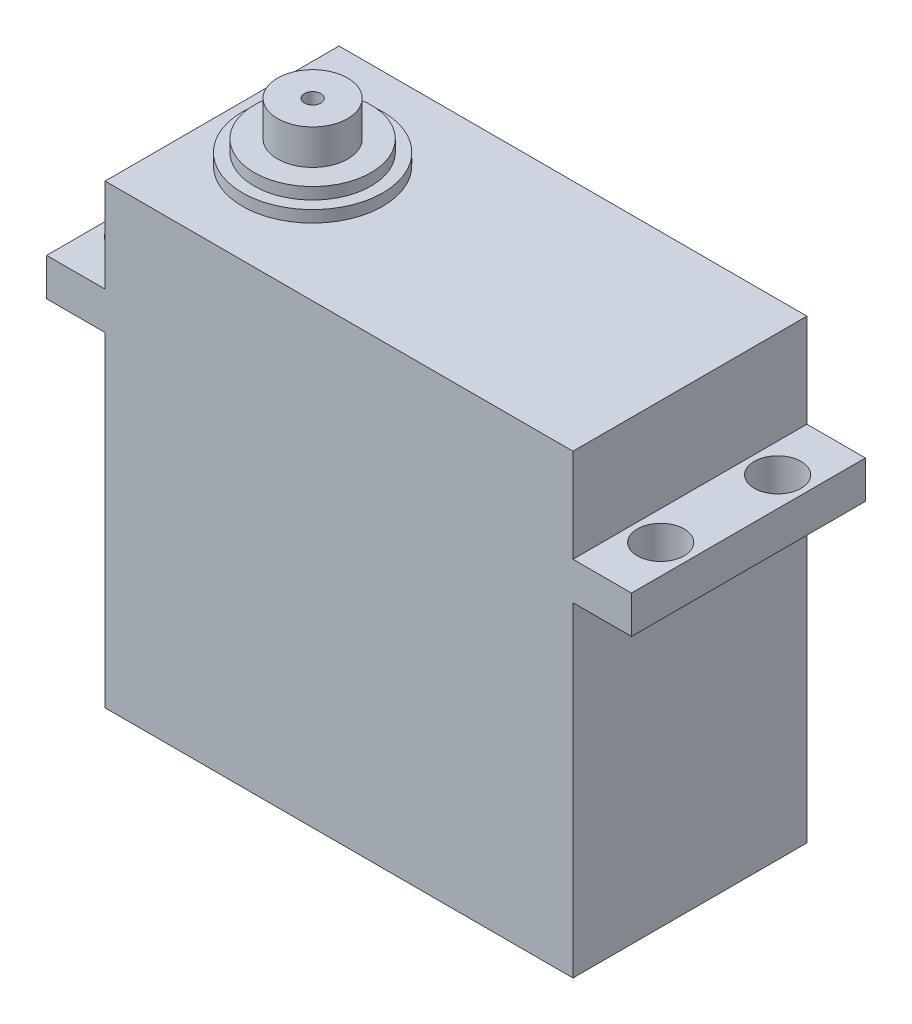
ISO-10303-21;
HEADER;
FILE_DESCRIPTION(('STEP AP214'),'2;1');
FILE_NAME('part.step','',(''),(''),'','','');
FILE_SCHEMA(('AUTOMOTIVE_DESIGN { 1 0 10303 214 1 1 1 1 }'));
ENDSEC;
DATA;
#1=APPLICATION_CONTEXT('core data for automotive mechanical design processes');
#2=APPLICATION_PROTOCOL_DEFINITION('international standard','automotive_design',2000,#1);
#3=PRODUCT_CONTEXT('',#1,'mechanical');
#4=PRODUCT('Part','Part','',(#3));
#5=PRODUCT_RELATED_PRODUCT_CATEGORY('part','',(#4));
#6=PRODUCT_DEFINITION_FORMATION('','',#4);
#7=PRODUCT_DEFINITION_CONTEXT('part definition',#1,'design');
#8=PRODUCT_DEFINITION('design','',#6,#7);
#9=PRODUCT_DEFINITION_SHAPE('','',#8);
#10=(LENGTH_UNIT() NAMED_UNIT(*) SI_UNIT(.MILLI.,.METRE.));
#11=(NAMED_UNIT(*) PLANE_ANGLE_UNIT() SI_UNIT($,.RADIAN.));
#12=(NAMED_UNIT(*) SI_UNIT($,.STERADIAN.) SOLID_ANGLE_UNIT());
#13=UNCERTAINTY_MEASURE_WITH_UNIT(LENGTH_MEASURE(1.E-05),#10,'distance_accuracy_value','');
#14=(GEOMETRIC_REPRESENTATION_CONTEXT(3) GLOBAL_UNCERTAINTY_ASSIGNED_CONTEXT((#13)) GLOBAL_UNIT_ASSIGNED_CONTEXT((#10,
#11,#12)) REPRESENTATION_CONTEXT('',''));
#15=CARTESIAN_POINT('',(0.,0.,0.));
#16=DIRECTION('',(0.,0.,1.));
#17=DIRECTION('',(1.,0.,0.));
#18=AXIS2_PLACEMENT_3D('',#15,#16,#17);
#19=CARTESIAN_POINT('',(7.01195219123506,37.7942609289085,20.));
#20=DIRECTION('',(-1.,0.,0.));
#21=DIRECTION('',(0.,0.,1.));
#22=AXIS2_PLACEMENT_3D('',#19,#20,#21);
#23=PLANE('',#22);
#24=DIRECTION('',(0.,0.,1.));
#25=VECTOR('',#24,1.);
#26=CARTESIAN_POINT('',(7.01195219123506,29.7942609289085,20.));
#27=LINE('',#26,#25);
#28=CARTESIAN_POINT('',(7.01195219123506,29.7942609289085,0.));
#29=VERTEX_POINT('',#28);
#30=CARTESIAN_POINT('',(7.01195219123506,29.7942609289085,20.));
#31=VERTEX_POINT('',#30);
#32=EDGE_CURVE('E155',#29,#31,#27,.T.);
#33=ORIENTED_EDGE('',*,*,#32,.F.);
#34=DIRECTION('',(0.,1.,0.));
#35=VECTOR('',#34,1.);
#36=CARTESIAN_POINT('',(7.01195219123506,37.7942609289085,0.));
#37=LINE('',#36,#35);
#38=CARTESIAN_POINT('',(7.01195219123506,37.7942609289085,0.));
#39=VERTEX_POINT('',#38);
#40=EDGE_CURVE('E203',#29,#39,#37,.T.);
#41=ORIENTED_EDGE('',*,*,#40,.T.);
#42=DIRECTION('',(0.,0.,-1.));
#43=VECTOR('',#42,1.);
#44=CARTESIAN_POINT('',(7.01195219123506,37.7942609289085,20.));
#45=LINE('',#44,#43);
#46=CARTESIAN_POINT('',(7.01195219123506,37.7942609289085,20.));
#47=VERTEX_POINT('',#46);
#48=EDGE_CURVE('E51',#47,#39,#45,.T.);
#49=ORIENTED_EDGE('',*,*,#48,.F.);
#50=DIRECTION('',(0.,1.,0.));
#51=VECTOR('',#50,1.);
#52=CARTESIAN_POINT('',(7.01195219123506,37.7942609289085,20.));
#53=LINE('',#52,#51);
#54=EDGE_CURVE('E59',#31,#47,#53,.T.);
#55=ORIENTED_EDGE('',*,*,#54,.F.);
#56=EDGE_LOOP('',(#33,#41,#49,#55));
#57=FACE_BOUND('',#56,.T.);
#58=ADVANCED_FACE('F42',(#57),#23,.F.);
#59=DIRECTION('',(0.,0.,-1.));
#60=VECTOR('',#59,1.);
#61=CARTESIAN_POINT('',(7.01195219123506,26.5790810906452,20.));
#62=LINE('',#61,#60);
#63=CARTESIAN_POINT('',(7.01195219123506,26.5790810906452,20.));
#64=VERTEX_POINT('',#63);
#65=CARTESIAN_POINT('',(7.01195219123506,26.5790810906452,0.));
#66=VERTEX_POINT('',#65);
#67=EDGE_CURVE('E67',#64,#66,#62,.T.);
#68=ORIENTED_EDGE('',*,*,#67,.F.);
#69=CARTESIAN_POINT('',(7.01195219123506,-1.20573907109151,20.));
#70=VERTEX_POINT('',#69);
#71=EDGE_CURVE('E158',#70,#64,#53,.T.);
#72=ORIENTED_EDGE('',*,*,#71,.F.);
#73=DIRECTION('',(0.,0.,-1.));
#74=VECTOR('',#73,1.);
#75=CARTESIAN_POINT('',(7.01195219123506,-1.20573907109151,20.));
#76=LINE('',#75,#74);
#77=CARTESIAN_POINT('',(7.01195219123506,-1.20573907109151,0.));
#78=VERTEX_POINT('',#77);
#79=EDGE_CURVE('E217',#70,#78,#76,.T.);
#80=ORIENTED_EDGE('',*,*,#79,.T.);
#81=EDGE_CURVE('E218',#78,#66,#37,.T.);
#82=ORIENTED_EDGE('',*,*,#81,.T.);
#83=EDGE_LOOP('',(#68,#72,#80,#82));
#84=FACE_BOUND('',#83,.T.);
#85=ADVANCED_FACE('F333',(#84),#23,.F.);
#86=CARTESIAN_POINT('',(-32.9880478087649,37.7942609289085,20.));
#87=DIRECTION('',(1.,0.,0.));
#88=DIRECTION('',(0.,0.,-1.));
#89=AXIS2_PLACEMENT_3D('',#86,#87,#88);
#90=PLANE('',#89);
#91=DIRECTION('',(0.,0.,-1.));
#92=VECTOR('',#91,1.);
#93=CARTESIAN_POINT('',(-32.9880478087649,29.7942609289085,0.));
#94=LINE('',#93,#92);
#95=CARTESIAN_POINT('',(-32.9880478087649,29.7942609289085,20.));
#96=VERTEX_POINT('',#95);
#97=CARTESIAN_POINT('',(-32.9880478087649,29.7942609289085,0.));
#98=VERTEX_POINT('',#97);
#99=EDGE_CURVE('E165',#96,#98,#94,.T.);
#100=ORIENTED_EDGE('',*,*,#99,.F.);
#101=DIRECTION('',(0.,-1.,0.));
#102=VECTOR('',#101,1.);
#103=CARTESIAN_POINT('',(-32.9880478087649,37.7942609289085,20.));
#104=LINE('',#103,#102);
#105=CARTESIAN_POINT('',(-32.9880478087649,37.7942609289085,20.));
#106=VERTEX_POINT('',#105);
#107=EDGE_CURVE('E210',#106,#96,#104,.T.);
#108=ORIENTED_EDGE('',*,*,#107,.F.);
#109=DIRECTION('',(0.,0.,-1.));
#110=VECTOR('',#109,1.);
#111=CARTESIAN_POINT('',(-32.9880478087649,37.7942609289085,20.));
#112=LINE('',#111,#110);
#113=CARTESIAN_POINT('',(-32.9880478087649,37.7942609289085,0.));
#114=VERTEX_POINT('',#113);
#115=EDGE_CURVE('E238',#106,#114,#112,.T.);
#116=ORIENTED_EDGE('',*,*,#115,.T.);
#117=DIRECTION('',(0.,-1.,0.));
#118=VECTOR('',#117,1.);
#119=CARTESIAN_POINT('',(-32.9880478087649,37.7942609289085,0.));
#120=LINE('',#119,#118);
#121=EDGE_CURVE('E225',#114,#98,#120,.T.);
#122=ORIENTED_EDGE('',*,*,#121,.T.);
#123=EDGE_LOOP('',(#100,#108,#116,#122));
#124=FACE_BOUND('',#123,.T.);
#125=ADVANCED_FACE('F335',(#124),#90,.F.);
#126=DIRECTION('',(0.,0.,1.));
#127=VECTOR('',#126,1.);
#128=CARTESIAN_POINT('',(-32.9880478087649,26.5790810906452,0.));
#129=LINE('',#128,#127);
#130=CARTESIAN_POINT('',(-32.9880478087649,26.5790810906452,0.));
#131=VERTEX_POINT('',#130);
#132=CARTESIAN_POINT('',(-32.9880478087649,26.5790810906452,20.));
#133=VERTEX_POINT('',#132);
#134=EDGE_CURVE('E160',#131,#133,#129,.T.);
#135=ORIENTED_EDGE('',*,*,#134,.F.);
#136=CARTESIAN_POINT('',(-32.9880478087649,-1.20573907109151,0.));
#137=VERTEX_POINT('',#136);
#138=EDGE_CURVE('E224',#131,#137,#120,.T.);
#139=ORIENTED_EDGE('',*,*,#138,.T.);
#140=DIRECTION('',(0.,0.,-1.));
#141=VECTOR('',#140,1.);
#142=CARTESIAN_POINT('',(-32.9880478087649,-1.20573907109151,20.));
#143=LINE('',#142,#141);
#144=CARTESIAN_POINT('',(-32.9880478087649,-1.20573907109151,20.));
#145=VERTEX_POINT('',#144);
#146=EDGE_CURVE('E234',#145,#137,#143,.T.);
#147=ORIENTED_EDGE('',*,*,#146,.F.);
#148=EDGE_CURVE('E209',#133,#145,#104,.T.);
#149=ORIENTED_EDGE('',*,*,#148,.F.);
#150=EDGE_LOOP('',(#135,#139,#147,#149));
#151=FACE_BOUND('',#150,.T.);
#152=ADVANCED_FACE('F328',(#151),#90,.F.);
#153=CARTESIAN_POINT('',(-32.9880478087649,37.7942609289085,20.));
#154=DIRECTION('',(0.,-1.,0.));
#155=DIRECTION('',(0.,0.,-1.));
#156=AXIS2_PLACEMENT_3D('',#153,#154,#155);
#157=PLANE('',#156);
#158=CARTESIAN_POINT('',(-25.2449941629393,37.7942609289085,10.));
#159=DIRECTION('',(0.,-1.,0.));
#160=DIRECTION('',(0.,0.,-1.));
#161=AXIS2_PLACEMENT_3D('',#158,#159,#160);
#162=CIRCLE('',#161,6.);
#163=CARTESIAN_POINT('',(-25.2449941629393,37.7942609289085,4.));
#164=VERTEX_POINT('',#163);
#165=EDGE_CURVE('E11',#164,#164,#162,.F.);
#166=ORIENTED_EDGE('',*,*,#165,.F.);
#167=EDGE_LOOP('',(#166));
#168=FACE_BOUND('',#167,.T.);
#169=DIRECTION('',(-1.,0.,0.));
#170=VECTOR('',#169,1.);
#171=CARTESIAN_POINT('',(-32.9880478087649,37.7942609289085,0.));
#172=LINE('',#171,#170);
#173=EDGE_CURVE('E221',#39,#114,#172,.T.);
#174=ORIENTED_EDGE('',*,*,#173,.T.);
#175=ORIENTED_EDGE('',*,*,#115,.F.);
#176=DIRECTION('',(-1.,0.,0.));
#177=VECTOR('',#176,1.);
#178=CARTESIAN_POINT('',(-32.9880478087649,37.7942609289085,20.));
#179=LINE('',#178,#177);
#180=EDGE_CURVE('E206',#47,#106,#179,.T.);
#181=ORIENTED_EDGE('',*,*,#180,.F.);
#182=ORIENTED_EDGE('',*,*,#48,.T.);
#183=EDGE_LOOP('',(#174,#175,#181,#182));
#184=FACE_BOUND('',#183,.T.);
#185=ADVANCED_FACE('F477',(#168,#184),#157,.F.);
#186=CARTESIAN_POINT('',(-32.9880478087649,-1.20573907109151,20.));
#187=DIRECTION('',(0.,1.,0.));
#188=DIRECTION('',(0.,0.,1.));
#189=AXIS2_PLACEMENT_3D('',#186,#187,#188);
#190=PLANE('',#189);
#191=DIRECTION('',(1.,0.,0.));
#192=VECTOR('',#191,1.);
#193=CARTESIAN_POINT('',(-32.9880478087649,-1.20573907109151,0.));
#194=LINE('',#193,#192);
#195=EDGE_CURVE('E228',#137,#78,#194,.T.);
#196=ORIENTED_EDGE('',*,*,#195,.T.);
#197=ORIENTED_EDGE('',*,*,#79,.F.);
#198=DIRECTION('',(1.,0.,0.));
#199=VECTOR('',#198,1.);
#200=CARTESIAN_POINT('',(-32.9880478087649,-1.20573907109151,20.));
#201=LINE('',#200,#199);
#202=EDGE_CURVE('E214',#145,#70,#201,.T.);
#203=ORIENTED_EDGE('',*,*,#202,.F.);
#204=ORIENTED_EDGE('',*,*,#146,.T.);
#205=EDGE_LOOP('',(#196,#197,#203,#204));
#206=FACE_BOUND('',#205,.T.);
#207=ADVANCED_FACE('F332',(#206),#190,.F.);
#208=CARTESIAN_POINT('',(0.,0.,20.));
#209=DIRECTION('',(0.,0.,1.));
#210=DIRECTION('',(1.,0.,0.));
#211=AXIS2_PLACEMENT_3D('',#208,#209,#210);
#212=PLANE('',#211);
#213=ORIENTED_EDGE('',*,*,#71,.T.);
#214=DIRECTION('',(-1.,0.,0.));
#215=VECTOR('',#214,1.);
#216=CARTESIAN_POINT('',(12.0119521912351,26.5790810906452,20.));
#217=LINE('',#216,#215);
#218=CARTESIAN_POINT('',(12.0119521912351,26.5790810906452,20.));
#219=VERTEX_POINT('',#218);
#220=EDGE_CURVE('E138',#219,#64,#217,.T.);
#221=ORIENTED_EDGE('',*,*,#220,.F.);
#222=DIRECTION('',(0.,-1.,0.));
#223=VECTOR('',#222,1.);
#224=CARTESIAN_POINT('',(12.0119521912351,29.7942609289085,20.));
#225=LINE('',#224,#223);
#226=CARTESIAN_POINT('',(12.0119521912351,29.7942609289085,20.));
#227=VERTEX_POINT('',#226);
#228=EDGE_CURVE('E145',#227,#219,#225,.T.);
#229=ORIENTED_EDGE('',*,*,#228,.F.);
#230=DIRECTION('',(-1.,0.,0.));
#231=VECTOR('',#230,1.);
#232=CARTESIAN_POINT('',(12.0119521912351,29.7942609289085,20.));
#233=LINE('',#232,#231);
#234=EDGE_CURVE('E301',#227,#31,#233,.T.);
#235=ORIENTED_EDGE('',*,*,#234,.T.);
#236=ORIENTED_EDGE('',*,*,#54,.T.);
#237=ORIENTED_EDGE('',*,*,#180,.T.);
#238=ORIENTED_EDGE('',*,*,#107,.T.);
#239=DIRECTION('',(1.,0.,0.));
#240=VECTOR('',#239,1.);
#241=CARTESIAN_POINT('',(-37.9880478087649,29.7942609289085,20.));
#242=LINE('',#241,#240);
#243=CARTESIAN_POINT('',(-37.9880478087649,29.7942609289085,20.));
#244=VERTEX_POINT('',#243);
#245=EDGE_CURVE('E191',#244,#96,#242,.T.);
#246=ORIENTED_EDGE('',*,*,#245,.F.);
#247=DIRECTION('',(0.,1.,0.));
#248=VECTOR('',#247,1.);
#249=CARTESIAN_POINT('',(-37.9880478087649,29.7942609289085,20.));
#250=LINE('',#249,#248);
#251=CARTESIAN_POINT('',(-37.9880478087649,26.5790810906452,20.));
#252=VERTEX_POINT('',#251);
#253=EDGE_CURVE('E178',#252,#244,#250,.T.);
#254=ORIENTED_EDGE('',*,*,#253,.F.);
#255=DIRECTION('',(1.,0.,0.));
#256=VECTOR('',#255,1.);
#257=CARTESIAN_POINT('',(-37.9880478087649,26.5790810906452,20.));
#258=LINE('',#257,#256);
#259=EDGE_CURVE('E195',#252,#133,#258,.T.);
#260=ORIENTED_EDGE('',*,*,#259,.T.);
#261=ORIENTED_EDGE('',*,*,#148,.T.);
#262=ORIENTED_EDGE('',*,*,#202,.T.);
#263=EDGE_LOOP('',(#213,#221,#229,#235,#236,#237,#238,#246,#254,#260,#261,#262));
#264=FACE_BOUND('',#263,.T.);
#265=ADVANCED_FACE('F157',(#264),#212,.T.);
#266=CARTESIAN_POINT('',(0.,0.,0.));
#267=DIRECTION('',(0.,0.,1.));
#268=DIRECTION('',(1.,0.,0.));
#269=AXIS2_PLACEMENT_3D('',#266,#267,#268);
#270=PLANE('',#269);
#271=ORIENTED_EDGE('',*,*,#81,.F.);
#272=ORIENTED_EDGE('',*,*,#195,.F.);
#273=ORIENTED_EDGE('',*,*,#138,.F.);
#274=DIRECTION('',(1.,0.,0.));
#275=VECTOR('',#274,1.);
#276=CARTESIAN_POINT('',(-37.9880478087649,26.5790810906452,0.));
#277=LINE('',#276,#275);
#278=CARTESIAN_POINT('',(-37.9880478087649,26.5790810906452,0.));
#279=VERTEX_POINT('',#278);
#280=EDGE_CURVE('E199',#279,#131,#277,.T.);
#281=ORIENTED_EDGE('',*,*,#280,.F.);
#282=DIRECTION('',(0.,-1.,0.));
#283=VECTOR('',#282,1.);
#284=CARTESIAN_POINT('',(-37.9880478087649,29.7942609289085,0.));
#285=LINE('',#284,#283);
#286=CARTESIAN_POINT('',(-37.9880478087649,29.7942609289085,0.));
#287=VERTEX_POINT('',#286);
#288=EDGE_CURVE('E171',#287,#279,#285,.T.);
#289=ORIENTED_EDGE('',*,*,#288,.F.);
#290=DIRECTION('',(1.,0.,0.));
#291=VECTOR('',#290,1.);
#292=CARTESIAN_POINT('',(-37.9880478087649,29.7942609289085,0.));
#293=LINE('',#292,#291);
#294=EDGE_CURVE('E183',#287,#98,#293,.T.);
#295=ORIENTED_EDGE('',*,*,#294,.T.);
#296=ORIENTED_EDGE('',*,*,#121,.F.);
#297=ORIENTED_EDGE('',*,*,#173,.F.);
#298=ORIENTED_EDGE('',*,*,#40,.F.);
#299=DIRECTION('',(-1.,0.,0.));
#300=VECTOR('',#299,1.);
#301=CARTESIAN_POINT('',(12.0119521912351,29.7942609289085,0.));
#302=LINE('',#301,#300);
#303=CARTESIAN_POINT('',(12.0119521912351,29.7942609289085,0.));
#304=VERTEX_POINT('',#303);
#305=EDGE_CURVE('E167',#304,#29,#302,.T.);
#306=ORIENTED_EDGE('',*,*,#305,.F.);
#307=DIRECTION('',(0.,1.,0.));
#308=VECTOR('',#307,1.);
#309=CARTESIAN_POINT('',(12.0119521912351,29.7942609289085,0.));
#310=LINE('',#309,#308);
#311=CARTESIAN_POINT('',(12.0119521912351,26.5790810906452,0.));
#312=VERTEX_POINT('',#311);
#313=EDGE_CURVE('E144',#312,#304,#310,.T.);
#314=ORIENTED_EDGE('',*,*,#313,.F.);
#315=DIRECTION('',(-1.,0.,0.));
#316=VECTOR('',#315,1.);
#317=CARTESIAN_POINT('',(12.0119521912351,26.5790810906452,0.));
#318=LINE('',#317,#316);
#319=EDGE_CURVE('E140',#312,#66,#318,.T.);
#320=ORIENTED_EDGE('',*,*,#319,.T.);
#321=EDGE_LOOP('',(#271,#272,#273,#281,#289,#295,#296,#297,#298,#306,#314,#320));
#322=FACE_BOUND('',#321,.T.);
#323=ADVANCED_FACE('F315',(#322),#270,.F.);
#324=CARTESIAN_POINT('',(-37.9880478087649,26.5790810906452,0.));
#325=DIRECTION('',(0.,1.,0.));
#326=DIRECTION('',(0.,0.,1.));
#327=AXIS2_PLACEMENT_3D('',#324,#325,#326);
#328=PLANE('',#327);
#329=CARTESIAN_POINT('',(-35.4880478087649,26.5790810889085,5.33897843853245));
#330=DIRECTION('',(0.,1.,0.));
#331=DIRECTION('',(0.,0.,1.));
#332=AXIS2_PLACEMENT_3D('',#329,#330,#331);
#333=CIRCLE('',#332,2.);
#334=CARTESIAN_POINT('',(-35.4880478087649,26.5790810889085,7.33897843853245));
#335=VERTEX_POINT('',#334);
#336=EDGE_CURVE('E282',#335,#335,#333,.T.);
#337=ORIENTED_EDGE('',*,*,#336,.T.);
#338=EDGE_LOOP('',(#337));
#339=FACE_BOUND('',#338,.T.);
#340=CARTESIAN_POINT('',(-35.4880478087649,26.5790810889085,14.7315051308545));
#341=DIRECTION('',(0.,1.,0.));
#342=DIRECTION('',(0.,0.,1.));
#343=AXIS2_PLACEMENT_3D('',#340,#341,#342);
#344=CIRCLE('',#343,2.);
#345=CARTESIAN_POINT('',(-35.4880478087649,26.5790810889085,16.7315051308545));
#346=VERTEX_POINT('',#345);
#347=EDGE_CURVE('E290',#346,#346,#344,.T.);
#348=ORIENTED_EDGE('',*,*,#347,.T.);
#349=EDGE_LOOP('',(#348));
#350=FACE_BOUND('',#349,.T.);
#351=ORIENTED_EDGE('',*,*,#134,.T.);
#352=ORIENTED_EDGE('',*,*,#259,.F.);
#353=DIRECTION('',(0.,0.,1.));
#354=VECTOR('',#353,1.);
#355=CARTESIAN_POINT('',(-37.9880478087649,26.5790810906452,0.));
#356=LINE('',#355,#354);
#357=EDGE_CURVE('E175',#279,#252,#356,.T.);
#358=ORIENTED_EDGE('',*,*,#357,.F.);
#359=ORIENTED_EDGE('',*,*,#280,.T.);
#360=EDGE_LOOP('',(#351,#352,#358,#359));
#361=FACE_BOUND('',#360,.T.);
#362=ADVANCED_FACE('F375',(#339,#350,#361),#328,.F.);
#363=CARTESIAN_POINT('',(-37.9880478087649,29.7942609289085,0.));
#364=DIRECTION('',(0.,-1.,0.));
#365=DIRECTION('',(0.,0.,-1.));
#366=AXIS2_PLACEMENT_3D('',#363,#364,#365);
#367=PLANE('',#366);
#368=CARTESIAN_POINT('',(-35.4880478087649,29.7942609289085,5.33897843853245));
#369=DIRECTION('',(0.,1.,0.));
#370=DIRECTION('',(0.,0.,1.));
#371=AXIS2_PLACEMENT_3D('',#368,#369,#370);
#372=CIRCLE('',#371,2.);
#373=CARTESIAN_POINT('',(-35.4880478087649,29.7942609289085,7.33897843853245));
#374=VERTEX_POINT('',#373);
#375=EDGE_CURVE('E286',#374,#374,#372,.T.);
#376=ORIENTED_EDGE('',*,*,#375,.F.);
#377=EDGE_LOOP('',(#376));
#378=FACE_BOUND('',#377,.T.);
#379=CARTESIAN_POINT('',(-35.4880478087649,29.7942609289085,14.7315051308545));
#380=DIRECTION('',(0.,1.,0.));
#381=DIRECTION('',(0.,0.,1.));
#382=AXIS2_PLACEMENT_3D('',#379,#380,#381);
#383=CIRCLE('',#382,2.);
#384=CARTESIAN_POINT('',(-35.4880478087649,29.7942609289085,16.7315051308545));
#385=VERTEX_POINT('',#384);
#386=EDGE_CURVE('E270',#385,#385,#383,.T.);
#387=ORIENTED_EDGE('',*,*,#386,.F.);
#388=EDGE_LOOP('',(#387));
#389=FACE_BOUND('',#388,.T.);
#390=ORIENTED_EDGE('',*,*,#99,.T.);
#391=ORIENTED_EDGE('',*,*,#294,.F.);
#392=DIRECTION('',(0.,0.,-1.));
#393=VECTOR('',#392,1.);
#394=CARTESIAN_POINT('',(-37.9880478087649,29.7942609289085,0.));
#395=LINE('',#394,#393);
#396=EDGE_CURVE('E181',#244,#287,#395,.T.);
#397=ORIENTED_EDGE('',*,*,#396,.F.);
#398=ORIENTED_EDGE('',*,*,#245,.T.);
#399=EDGE_LOOP('',(#390,#391,#397,#398));
#400=FACE_BOUND('',#399,.T.);
#401=ADVANCED_FACE('F400',(#378,#389,#400),#367,.F.);
#402=CARTESIAN_POINT('',(-37.9880478087649,0.,0.));
#403=DIRECTION('',(-1.,0.,0.));
#404=DIRECTION('',(0.,0.,1.));
#405=AXIS2_PLACEMENT_3D('',#402,#403,#404);
#406=PLANE('',#405);
#407=ORIENTED_EDGE('',*,*,#288,.T.);
#408=ORIENTED_EDGE('',*,*,#357,.T.);
#409=ORIENTED_EDGE('',*,*,#253,.T.);
#410=ORIENTED_EDGE('',*,*,#396,.T.);
#411=EDGE_LOOP('',(#407,#408,#409,#410));
#412=FACE_BOUND('',#411,.T.);
#413=ADVANCED_FACE('F351',(#412),#406,.T.);
#414=CARTESIAN_POINT('',(12.0119521912351,26.5790810906452,20.));
#415=DIRECTION('',(0.,1.,0.));
#416=DIRECTION('',(0.,0.,1.));
#417=AXIS2_PLACEMENT_3D('',#414,#415,#416);
#418=PLANE('',#417);
#419=CARTESIAN_POINT('',(9.51195219123506,26.5790810889085,15.));
#420=DIRECTION('',(0.,1.,0.));
#421=DIRECTION('',(0.,0.,1.));
#422=AXIS2_PLACEMENT_3D('',#419,#420,#421);
#423=CIRCLE('',#422,2.);
#424=CARTESIAN_POINT('',(9.51195219123506,26.5790810889085,17.));
#425=VERTEX_POINT('',#424);
#426=EDGE_CURVE('E266',#425,#425,#423,.T.);
#427=ORIENTED_EDGE('',*,*,#426,.T.);
#428=EDGE_LOOP('',(#427));
#429=FACE_BOUND('',#428,.T.);
#430=CARTESIAN_POINT('',(9.51195219123506,26.5790810889085,5.));
#431=DIRECTION('',(0.,1.,0.));
#432=DIRECTION('',(0.,0.,1.));
#433=AXIS2_PLACEMENT_3D('',#430,#431,#432);
#434=CIRCLE('',#433,2.);
#435=CARTESIAN_POINT('',(9.51195219123506,26.5790810889085,7.));
#436=VERTEX_POINT('',#435);
#437=EDGE_CURVE('E254',#436,#436,#434,.T.);
#438=ORIENTED_EDGE('',*,*,#437,.T.);
#439=EDGE_LOOP('',(#438));
#440=FACE_BOUND('',#439,.T.);
#441=ORIENTED_EDGE('',*,*,#67,.T.);
#442=ORIENTED_EDGE('',*,*,#319,.F.);
#443=DIRECTION('',(0.,0.,-1.));
#444=VECTOR('',#443,1.);
#445=CARTESIAN_POINT('',(12.0119521912351,26.5790810906452,20.));
#446=LINE('',#445,#444);
#447=EDGE_CURVE('E134',#219,#312,#446,.T.);
#448=ORIENTED_EDGE('',*,*,#447,.F.);
#449=ORIENTED_EDGE('',*,*,#220,.T.);
#450=EDGE_LOOP('',(#441,#442,#448,#449));
#451=FACE_BOUND('',#450,.T.);
#452=ADVANCED_FACE('F136',(#429,#440,#451),#418,.F.);
#453=CARTESIAN_POINT('',(12.0119521912351,29.7942609289085,20.));
#454=DIRECTION('',(0.,-1.,0.));
#455=DIRECTION('',(0.,0.,-1.));
#456=AXIS2_PLACEMENT_3D('',#453,#454,#455);
#457=PLANE('',#456);
#458=CARTESIAN_POINT('',(9.51195219123506,29.7942609289085,15.));
#459=DIRECTION('',(0.,1.,0.));
#460=DIRECTION('',(0.,0.,1.));
#461=AXIS2_PLACEMENT_3D('',#458,#459,#460);
#462=CIRCLE('',#461,2.);
#463=CARTESIAN_POINT('',(9.51195219123506,29.7942609289085,17.));
#464=VERTEX_POINT('',#463);
#465=EDGE_CURVE('E271',#464,#464,#462,.T.);
#466=ORIENTED_EDGE('',*,*,#465,.F.);
#467=EDGE_LOOP('',(#466));
#468=FACE_BOUND('',#467,.T.);
#469=CARTESIAN_POINT('',(9.51195219123506,29.7942609289085,5.));
#470=DIRECTION('',(0.,1.,0.));
#471=DIRECTION('',(0.,0.,1.));
#472=AXIS2_PLACEMENT_3D('',#469,#470,#471);
#473=CIRCLE('',#472,2.);
#474=CARTESIAN_POINT('',(9.51195219123506,29.7942609289085,7.));
#475=VERTEX_POINT('',#474);
#476=EDGE_CURVE('E275',#475,#475,#473,.T.);
#477=ORIENTED_EDGE('',*,*,#476,.F.);
#478=EDGE_LOOP('',(#477));
#479=FACE_BOUND('',#478,.T.);
#480=ORIENTED_EDGE('',*,*,#32,.T.);
#481=ORIENTED_EDGE('',*,*,#234,.F.);
#482=DIRECTION('',(0.,0.,1.));
#483=VECTOR('',#482,1.);
#484=CARTESIAN_POINT('',(12.0119521912351,29.7942609289085,20.));
#485=LINE('',#484,#483);
#486=EDGE_CURVE('E150',#304,#227,#485,.T.);
#487=ORIENTED_EDGE('',*,*,#486,.F.);
#488=ORIENTED_EDGE('',*,*,#305,.T.);
#489=EDGE_LOOP('',(#480,#481,#487,#488));
#490=FACE_BOUND('',#489,.T.);
#491=ADVANCED_FACE('F311',(#468,#479,#490),#457,.F.);
#492=CARTESIAN_POINT('',(12.0119521912351,0.,0.));
#493=DIRECTION('',(1.,0.,0.));
#494=DIRECTION('',(0.,0.,-1.));
#495=AXIS2_PLACEMENT_3D('',#492,#493,#494);
#496=PLANE('',#495);
#497=ORIENTED_EDGE('',*,*,#228,.T.);
#498=ORIENTED_EDGE('',*,*,#447,.T.);
#499=ORIENTED_EDGE('',*,*,#313,.T.);
#500=ORIENTED_EDGE('',*,*,#486,.T.);
#501=EDGE_LOOP('',(#497,#498,#499,#500));
#502=FACE_BOUND('',#501,.T.);
#503=ADVANCED_FACE('F148',(#502),#496,.T.);
#504=CARTESIAN_POINT('',(-35.4880478087649,26.5790810889085,14.7315051308545));
#505=DIRECTION('',(0.,1.,0.));
#506=DIRECTION('',(0.,0.,1.));
#507=AXIS2_PLACEMENT_3D('',#504,#505,#506);
#508=CYLINDRICAL_SURFACE('',#507,2.);
#509=ORIENTED_EDGE('',*,*,#347,.F.);
#510=EDGE_LOOP('',(#509));
#511=FACE_BOUND('',#510,.T.);
#512=ORIENTED_EDGE('',*,*,#386,.T.);
#513=EDGE_LOOP('',(#512));
#514=FACE_BOUND('',#513,.T.);
#515=ADVANCED_FACE('F387',(#511,#514),#508,.F.);
#516=CARTESIAN_POINT('',(-35.4880478087649,26.5790810889085,5.33897843853245));
#517=DIRECTION('',(0.,1.,0.));
#518=DIRECTION('',(0.,0.,1.));
#519=AXIS2_PLACEMENT_3D('',#516,#517,#518);
#520=CYLINDRICAL_SURFACE('',#519,2.);
#521=ORIENTED_EDGE('',*,*,#336,.F.);
#522=EDGE_LOOP('',(#521));
#523=FACE_BOUND('',#522,.T.);
#524=ORIENTED_EDGE('',*,*,#375,.T.);
#525=EDGE_LOOP('',(#524));
#526=FACE_BOUND('',#525,.T.);
#527=ADVANCED_FACE('F419',(#523,#526),#520,.F.);
#528=CARTESIAN_POINT('',(9.51195219123506,26.5790810889085,5.));
#529=DIRECTION('',(0.,1.,0.));
#530=DIRECTION('',(0.,0.,1.));
#531=AXIS2_PLACEMENT_3D('',#528,#529,#530);
#532=CYLINDRICAL_SURFACE('',#531,2.);
#533=ORIENTED_EDGE('',*,*,#437,.F.);
#534=EDGE_LOOP('',(#533));
#535=FACE_BOUND('',#534,.T.);
#536=ORIENTED_EDGE('',*,*,#476,.T.);
#537=EDGE_LOOP('',(#536));
#538=FACE_BOUND('',#537,.T.);
#539=ADVANCED_FACE('F430',(#535,#538),#532,.F.);
#540=CARTESIAN_POINT('',(9.51195219123506,26.5790810889085,15.));
#541=DIRECTION('',(0.,1.,0.));
#542=DIRECTION('',(0.,0.,1.));
#543=AXIS2_PLACEMENT_3D('',#540,#541,#542);
#544=CYLINDRICAL_SURFACE('',#543,2.);
#545=ORIENTED_EDGE('',*,*,#426,.F.);
#546=EDGE_LOOP('',(#545));
#547=FACE_BOUND('',#546,.T.);
#548=ORIENTED_EDGE('',*,*,#465,.T.);
#549=EDGE_LOOP('',(#548));
#550=FACE_BOUND('',#549,.T.);
#551=ADVANCED_FACE('F457',(#547,#550),#544,.F.);
#552=CARTESIAN_POINT('',(-25.2449941629393,38.7942609289085,10.));
#553=DIRECTION('',(0.,-1.,0.));
#554=DIRECTION('',(0.,0.,-1.));
#555=AXIS2_PLACEMENT_3D('',#552,#553,#554);
#556=CYLINDRICAL_SURFACE('',#555,6.);
#557=CARTESIAN_POINT('',(-25.2449941629393,38.7942609289085,10.));
#558=DIRECTION('',(0.,1.,0.));
#559=DIRECTION('',(0.,0.,1.));
#560=AXIS2_PLACEMENT_3D('',#557,#558,#559);
#561=CIRCLE('',#560,6.);
#562=CARTESIAN_POINT('',(-25.2449941629393,38.7942609289085,16.));
#563=VERTEX_POINT('',#562);
#564=EDGE_CURVE('E247',#563,#563,#561,.T.);
#565=ORIENTED_EDGE('',*,*,#564,.F.);
#566=EDGE_LOOP('',(#565));
#567=FACE_BOUND('',#566,.T.);
#568=ORIENTED_EDGE('',*,*,#165,.T.);
#569=EDGE_LOOP('',(#568));
#570=FACE_BOUND('',#569,.T.);
#571=ADVANCED_FACE('F468',(#567,#570),#556,.T.);
#572=CARTESIAN_POINT('',(-25.2449941629393,38.7942609289085,10.));
#573=DIRECTION('',(0.,1.,0.));
#574=DIRECTION('',(0.,0.,1.));
#575=AXIS2_PLACEMENT_3D('',#572,#573,#574);
#576=PLANE('',#575);
#577=CARTESIAN_POINT('',(-25.2449941629393,38.7942609289085,10.));
#578=DIRECTION('',(0.,1.,0.));
#579=DIRECTION('',(0.,0.,1.));
#580=AXIS2_PLACEMENT_3D('',#577,#578,#579);
#581=CIRCLE('',#580,5.);
#582=CARTESIAN_POINT('',(-25.2449941629393,38.7942609289085,15.));
#583=VERTEX_POINT('',#582);
#584=EDGE_CURVE('E244',#583,#583,#581,.F.);
#585=ORIENTED_EDGE('',*,*,#584,.T.);
#586=EDGE_LOOP('',(#585));
#587=FACE_BOUND('',#586,.T.);
#588=ORIENTED_EDGE('',*,*,#564,.T.);
#589=EDGE_LOOP('',(#588));
#590=FACE_BOUND('',#589,.T.);
#591=ADVANCED_FACE('F491',(#587,#590),#576,.T.);
#592=CARTESIAN_POINT('',(-25.2449941629393,39.7942609289085,10.));
#593=DIRECTION('',(0.,-1.,0.));
#594=DIRECTION('',(0.,0.,-1.));
#595=AXIS2_PLACEMENT_3D('',#592,#593,#594);
#596=CYLINDRICAL_SURFACE('',#595,5.);
#597=ORIENTED_EDGE('',*,*,#584,.F.);
#598=EDGE_LOOP('',(#597));
#599=FACE_BOUND('',#598,.T.);
#600=CARTESIAN_POINT('',(-25.2449941629393,39.7942609289085,10.));
#601=DIRECTION('',(0.,1.,0.));
#602=DIRECTION('',(0.,0.,1.));
#603=AXIS2_PLACEMENT_3D('',#600,#601,#602);
#604=CIRCLE('',#603,5.);
#605=CARTESIAN_POINT('',(-25.2449941629393,39.7942609289085,15.));
#606=VERTEX_POINT('',#605);
#607=EDGE_CURVE('E248',#606,#606,#604,.T.);
#608=ORIENTED_EDGE('',*,*,#607,.F.);
#609=EDGE_LOOP('',(#608));
#610=FACE_BOUND('',#609,.T.);
#611=ADVANCED_FACE('F502',(#599,#610),#596,.T.);
#612=CARTESIAN_POINT('',(-25.2449941629393,39.7942609289085,10.));
#613=DIRECTION('',(0.,1.,0.));
#614=DIRECTION('',(0.,0.,1.));
#615=AXIS2_PLACEMENT_3D('',#612,#613,#614);
#616=PLANE('',#615);
#617=CARTESIAN_POINT('',(-25.2449941629393,39.7942609289085,10.));
#618=DIRECTION('',(0.,1.,0.));
#619=DIRECTION('',(0.,0.,1.));
#620=AXIS2_PLACEMENT_3D('',#617,#618,#619);
#621=CIRCLE('',#620,3.);
#622=CARTESIAN_POINT('',(-25.2449941629393,39.7942609289085,13.));
#623=VERTEX_POINT('',#622);
#624=EDGE_CURVE('E45',#623,#623,#621,.F.);
#625=ORIENTED_EDGE('',*,*,#624,.T.);
#626=EDGE_LOOP('',(#625));
#627=FACE_BOUND('',#626,.T.);
#628=ORIENTED_EDGE('',*,*,#607,.T.);
#629=EDGE_LOOP('',(#628));
#630=FACE_BOUND('',#629,.T.);
#631=ADVANCED_FACE('F512',(#627,#630),#616,.T.);
#632=CARTESIAN_POINT('',(-25.2449941629393,42.7942609289085,10.));
#633=DIRECTION('',(0.,-1.,0.));
#634=DIRECTION('',(0.,0.,-1.));
#635=AXIS2_PLACEMENT_3D('',#632,#633,#634);
#636=CYLINDRICAL_SURFACE('',#635,3.);
#637=ORIENTED_EDGE('',*,*,#624,.F.);
#638=EDGE_LOOP('',(#637));
#639=FACE_BOUND('',#638,.T.);
#640=CARTESIAN_POINT('',(-25.2449941629393,42.7942609289085,10.));
#641=DIRECTION('',(0.,1.,0.));
#642=DIRECTION('',(0.,0.,1.));
#643=AXIS2_PLACEMENT_3D('',#640,#641,#642);
#644=CIRCLE('',#643,3.);
#645=CARTESIAN_POINT('',(-25.2449941629393,42.7942609289085,13.));
#646=VERTEX_POINT('',#645);
#647=EDGE_CURVE('E262',#646,#646,#644,.T.);
#648=ORIENTED_EDGE('',*,*,#647,.F.);
#649=EDGE_LOOP('',(#648));
#650=FACE_BOUND('',#649,.T.);
#651=ADVANCED_FACE('F531',(#639,#650),#636,.T.);
#652=CARTESIAN_POINT('',(-25.2449941629393,42.7942609289085,10.));
#653=DIRECTION('',(0.,1.,0.));
#654=DIRECTION('',(0.,0.,1.));
#655=AXIS2_PLACEMENT_3D('',#652,#653,#654);
#656=PLANE('',#655);
#657=CARTESIAN_POINT('',(-25.2449941629393,42.7942609289085,10.));
#658=DIRECTION('',(0.,1.,0.));
#659=DIRECTION('',(0.,0.,1.));
#660=AXIS2_PLACEMENT_3D('',#657,#658,#659);
#661=CIRCLE('',#660,0.705262344568665);
#662=CARTESIAN_POINT('',(-25.2449941629393,42.7942609289085,10.7052623445687));
#663=VERTEX_POINT('',#662);
#664=EDGE_CURVE('E613',#663,#663,#661,.T.);
#665=ORIENTED_EDGE('',*,*,#664,.F.);
#666=EDGE_LOOP('',(#665));
#667=FACE_BOUND('',#666,.T.);
#668=ORIENTED_EDGE('',*,*,#647,.T.);
#669=EDGE_LOOP('',(#668));
#670=FACE_BOUND('',#669,.T.);
#671=ADVANCED_FACE('F542',(#667,#670),#656,.T.);
#672=CARTESIAN_POINT('',(-25.2449941629393,2.79426092890849,10.));
#673=DIRECTION('',(0.,1.,0.));
#674=DIRECTION('',(0.,0.,1.));
#675=AXIS2_PLACEMENT_3D('',#672,#673,#674);
#676=CYLINDRICAL_SURFACE('',#675,0.705262344568665);
#677=CARTESIAN_POINT('',(-25.2449941629393,2.79426092890849,10.));
#678=DIRECTION('',(0.,1.,0.));
#679=DIRECTION('',(0.,0.,1.));
#680=AXIS2_PLACEMENT_3D('',#677,#678,#679);
#681=CIRCLE('',#680,0.705262344568665);
#682=CARTESIAN_POINT('',(-25.2449941629393,2.79426092890849,10.7052623445687));
#683=VERTEX_POINT('',#682);
#684=EDGE_CURVE('E611',#683,#683,#681,.T.);
#685=ORIENTED_EDGE('',*,*,#684,.F.);
#686=EDGE_LOOP('',(#685));
#687=FACE_BOUND('',#686,.T.);
#688=ORIENTED_EDGE('',*,*,#664,.T.);
#689=EDGE_LOOP('',(#688));
#690=FACE_BOUND('',#689,.T.);
#691=ADVANCED_FACE('F553',(#687,#690),#676,.F.);
#692=CARTESIAN_POINT('',(-25.2449941629393,2.79426092890849,10.));
#693=DIRECTION('',(0.,1.,0.));
#694=DIRECTION('',(0.,0.,1.));
#695=AXIS2_PLACEMENT_3D('',#692,#693,#694);
#696=PLANE('',#695);
#697=ORIENTED_EDGE('',*,*,#684,.T.);
#698=EDGE_LOOP('',(#697));
#699=FACE_BOUND('',#698,.T.);
#700=ADVANCED_FACE('F564',(#699),#696,.T.);
#701=CLOSED_SHELL('',(#58,#85,#125,#152,#185,#207,#265,#323,#362,#401,#413,#452,#491,#503,#515,
#527,#539,#551,#571,#591,#611,#631,#651,#671,#691,#700));
#702=MANIFOLD_SOLID_BREP('B2',#701);
#703=ADVANCED_BREP_SHAPE_REPRESENTATION('',(#18,#702),#14);
#704=SHAPE_DEFINITION_REPRESENTATION(#9,#703);
ENDSEC;
END-ISO-10303-21;
